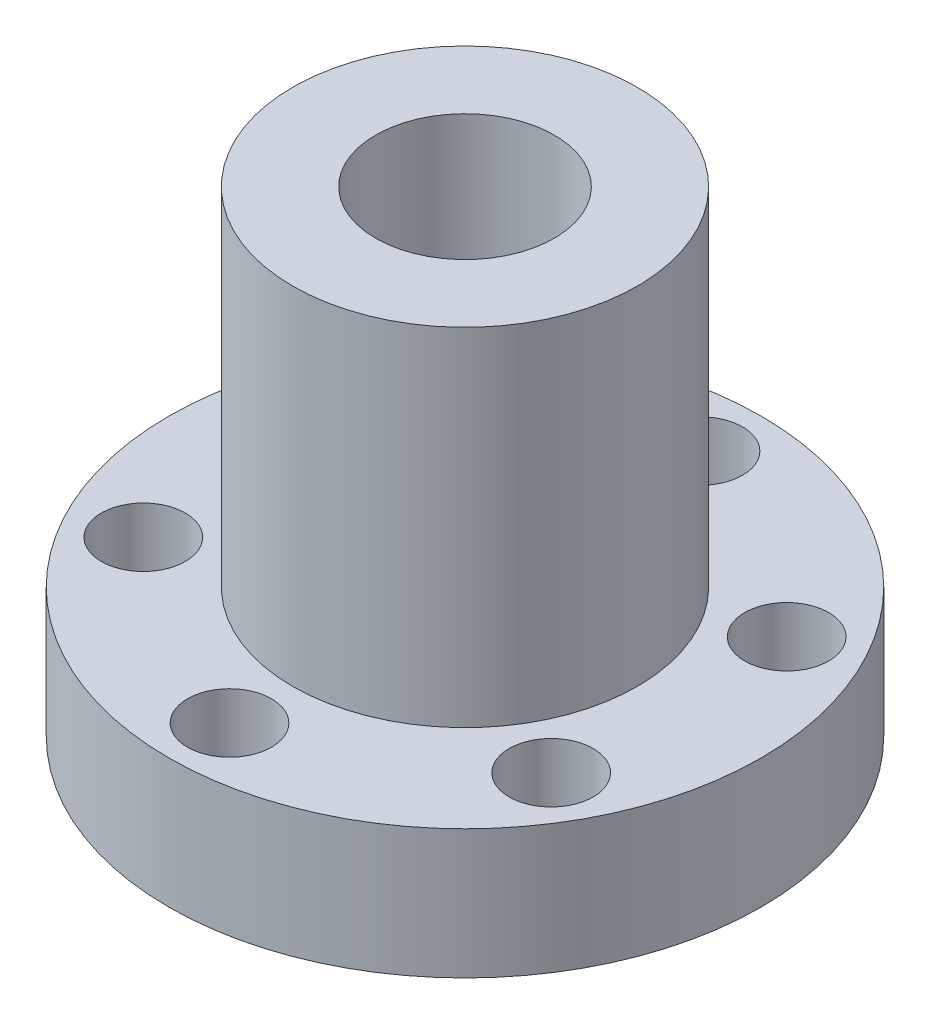
ISO-10303-21;
HEADER;
FILE_DESCRIPTION(('STEP AP214'),'2;1');
FILE_NAME('part.step','',(''),(''),'','','');
FILE_SCHEMA(('AUTOMOTIVE_DESIGN { 1 0 10303 214 1 1 1 1 }'));
ENDSEC;
DATA;
#1=APPLICATION_CONTEXT('core data for automotive mechanical design processes');
#2=APPLICATION_PROTOCOL_DEFINITION('international standard','automotive_design',2000,#1);
#3=PRODUCT_CONTEXT('',#1,'mechanical');
#4=PRODUCT('Part','Part','',(#3));
#5=PRODUCT_RELATED_PRODUCT_CATEGORY('part','',(#4));
#6=PRODUCT_DEFINITION_FORMATION('','',#4);
#7=PRODUCT_DEFINITION_CONTEXT('part definition',#1,'design');
#8=PRODUCT_DEFINITION('design','',#6,#7);
#9=PRODUCT_DEFINITION_SHAPE('','',#8);
#10=(LENGTH_UNIT() NAMED_UNIT(*) SI_UNIT(.MILLI.,.METRE.));
#11=(NAMED_UNIT(*) PLANE_ANGLE_UNIT() SI_UNIT($,.RADIAN.));
#12=(NAMED_UNIT(*) SI_UNIT($,.STERADIAN.) SOLID_ANGLE_UNIT());
#13=UNCERTAINTY_MEASURE_WITH_UNIT(LENGTH_MEASURE(1.E-05),#10,'distance_accuracy_value','');
#14=(GEOMETRIC_REPRESENTATION_CONTEXT(3) GLOBAL_UNCERTAINTY_ASSIGNED_CONTEXT((#13)) GLOBAL_UNIT_ASSIGNED_CONTEXT((#10,
#11,#12)) REPRESENTATION_CONTEXT('',''));
#15=CARTESIAN_POINT('',(0.,0.,0.));
#16=DIRECTION('',(0.,0.,1.));
#17=DIRECTION('',(1.,0.,0.));
#18=AXIS2_PLACEMENT_3D('',#15,#16,#17);
#19=CARTESIAN_POINT('',(0.,12.,0.));
#20=DIRECTION('',(0.,1.,0.));
#21=DIRECTION('',(0.,0.,1.));
#22=AXIS2_PLACEMENT_3D('',#19,#20,#21);
#23=PLANE('',#22);
#24=CARTESIAN_POINT('',(18.9399488772411,12.,10.9349845827129));
#25=DIRECTION('',(0.,1.,0.));
#26=DIRECTION('',(0.,0.,1.));
#27=AXIS2_PLACEMENT_3D('',#24,#25,#26);
#28=CIRCLE('',#27,3.9);
#29=CARTESIAN_POINT('',(18.9399488772411,12.,14.8349845827129));
#30=VERTEX_POINT('',#29);
#31=EDGE_CURVE('E57',#30,#30,#28,.F.);
#32=ORIENTED_EDGE('',*,*,#31,.T.);
#33=EDGE_LOOP('',(#32));
#34=FACE_BOUND('',#33,.T.);
#35=CARTESIAN_POINT('',(18.9399488772411,12.,-10.9349845827129));
#36=DIRECTION('',(0.,1.,0.));
#37=DIRECTION('',(0.,0.,1.));
#38=AXIS2_PLACEMENT_3D('',#35,#36,#37);
#39=CIRCLE('',#38,3.9);
#40=CARTESIAN_POINT('',(18.9399488772411,12.,-7.03498458271292));
#41=VERTEX_POINT('',#40);
#42=EDGE_CURVE('E60',#41,#41,#39,.F.);
#43=ORIENTED_EDGE('',*,*,#42,.T.);
#44=EDGE_LOOP('',(#43));
#45=FACE_BOUND('',#44,.T.);
#46=CARTESIAN_POINT('',(0.,12.,-21.8699691654258));
#47=DIRECTION('',(0.,1.,0.));
#48=DIRECTION('',(0.,0.,1.));
#49=AXIS2_PLACEMENT_3D('',#46,#47,#48);
#50=CIRCLE('',#49,3.9);
#51=CARTESIAN_POINT('',(0.,12.,-17.9699691654258));
#52=VERTEX_POINT('',#51);
#53=EDGE_CURVE('E63',#52,#52,#50,.F.);
#54=ORIENTED_EDGE('',*,*,#53,.T.);
#55=EDGE_LOOP('',(#54));
#56=FACE_BOUND('',#55,.T.);
#57=CARTESIAN_POINT('',(-18.9399488772411,12.,-10.9349845827129));
#58=DIRECTION('',(0.,1.,0.));
#59=DIRECTION('',(0.,0.,1.));
#60=AXIS2_PLACEMENT_3D('',#57,#58,#59);
#61=CIRCLE('',#60,3.9);
#62=CARTESIAN_POINT('',(-18.9399488772411,12.,-7.03498458271291));
#63=VERTEX_POINT('',#62);
#64=EDGE_CURVE('E66',#63,#63,#61,.F.);
#65=ORIENTED_EDGE('',*,*,#64,.T.);
#66=EDGE_LOOP('',(#65));
#67=FACE_BOUND('',#66,.T.);
#68=CARTESIAN_POINT('',(-18.9399488772411,12.,10.9349845827129));
#69=DIRECTION('',(0.,1.,0.));
#70=DIRECTION('',(0.,0.,1.));
#71=AXIS2_PLACEMENT_3D('',#68,#69,#70);
#72=CIRCLE('',#71,3.9);
#73=CARTESIAN_POINT('',(-18.9399488772411,12.,14.8349845827129));
#74=VERTEX_POINT('',#73);
#75=EDGE_CURVE('E69',#74,#74,#72,.F.);
#76=ORIENTED_EDGE('',*,*,#75,.T.);
#77=EDGE_LOOP('',(#76));
#78=FACE_BOUND('',#77,.T.);
#79=CARTESIAN_POINT('',(0.,12.,21.8699691654258));
#80=DIRECTION('',(0.,1.,0.));
#81=DIRECTION('',(0.,0.,1.));
#82=AXIS2_PLACEMENT_3D('',#79,#80,#81);
#83=CIRCLE('',#82,3.9);
#84=CARTESIAN_POINT('',(0.,12.,25.7699691654258));
#85=VERTEX_POINT('',#84);
#86=EDGE_CURVE('E72',#85,#85,#83,.F.);
#87=ORIENTED_EDGE('',*,*,#86,.T.);
#88=EDGE_LOOP('',(#87));
#89=FACE_BOUND('',#88,.T.);
#90=CARTESIAN_POINT('',(0.,12.,0.));
#91=DIRECTION('',(0.,1.,0.));
#92=DIRECTION('',(0.,0.,1.));
#93=AXIS2_PLACEMENT_3D('',#90,#91,#92);
#94=CIRCLE('',#93,27.5);
#95=CARTESIAN_POINT('',(0.,12.,27.5));
#96=VERTEX_POINT('',#95);
#97=EDGE_CURVE('E10',#96,#96,#94,.T.);
#98=ORIENTED_EDGE('',*,*,#97,.T.);
#99=EDGE_LOOP('',(#98));
#100=FACE_BOUND('',#99,.T.);
#101=CARTESIAN_POINT('',(0.,12.,0.));
#102=DIRECTION('',(0.,1.,0.));
#103=DIRECTION('',(0.,0.,1.));
#104=AXIS2_PLACEMENT_3D('',#101,#102,#103);
#105=CIRCLE('',#104,16.);
#106=CARTESIAN_POINT('',(0.,12.,16.));
#107=VERTEX_POINT('',#106);
#108=EDGE_CURVE('E50',#107,#107,#105,.T.);
#109=ORIENTED_EDGE('',*,*,#108,.F.);
#110=EDGE_LOOP('',(#109));
#111=FACE_BOUND('',#110,.T.);
#112=ADVANCED_FACE('F39',(#34,#45,#56,#67,#78,#89,#100,#111),#23,.T.);
#113=CARTESIAN_POINT('',(0.,0.,0.));
#114=DIRECTION('',(0.,1.,0.));
#115=DIRECTION('',(0.,0.,1.));
#116=AXIS2_PLACEMENT_3D('',#113,#114,#115);
#117=PLANE('',#116);
#118=CARTESIAN_POINT('',(18.9399488772411,0.,10.9349845827129));
#119=DIRECTION('',(0.,1.,0.));
#120=DIRECTION('',(0.,0.,1.));
#121=AXIS2_PLACEMENT_3D('',#118,#119,#120);
#122=CIRCLE('',#121,3.9);
#123=CARTESIAN_POINT('',(18.9399488772411,0.,14.8349845827129));
#124=VERTEX_POINT('',#123);
#125=EDGE_CURVE('E82',#124,#124,#122,.T.);
#126=ORIENTED_EDGE('',*,*,#125,.T.);
#127=EDGE_LOOP('',(#126));
#128=FACE_BOUND('',#127,.T.);
#129=CARTESIAN_POINT('',(18.9399488772411,0.,-10.9349845827129));
#130=DIRECTION('',(0.,1.,0.));
#131=DIRECTION('',(0.,0.,1.));
#132=AXIS2_PLACEMENT_3D('',#129,#130,#131);
#133=CIRCLE('',#132,3.9);
#134=CARTESIAN_POINT('',(18.9399488772411,0.,-7.03498458271292));
#135=VERTEX_POINT('',#134);
#136=EDGE_CURVE('E85',#135,#135,#133,.T.);
#137=ORIENTED_EDGE('',*,*,#136,.T.);
#138=EDGE_LOOP('',(#137));
#139=FACE_BOUND('',#138,.T.);
#140=CARTESIAN_POINT('',(0.,0.,-21.8699691654258));
#141=DIRECTION('',(0.,1.,0.));
#142=DIRECTION('',(0.,0.,1.));
#143=AXIS2_PLACEMENT_3D('',#140,#141,#142);
#144=CIRCLE('',#143,3.9);
#145=CARTESIAN_POINT('',(0.,0.,-17.9699691654258));
#146=VERTEX_POINT('',#145);
#147=EDGE_CURVE('E88',#146,#146,#144,.T.);
#148=ORIENTED_EDGE('',*,*,#147,.T.);
#149=EDGE_LOOP('',(#148));
#150=FACE_BOUND('',#149,.T.);
#151=CARTESIAN_POINT('',(-18.9399488772411,0.,-10.9349845827129));
#152=DIRECTION('',(0.,1.,0.));
#153=DIRECTION('',(0.,0.,1.));
#154=AXIS2_PLACEMENT_3D('',#151,#152,#153);
#155=CIRCLE('',#154,3.9);
#156=CARTESIAN_POINT('',(-18.9399488772411,0.,-7.03498458271291));
#157=VERTEX_POINT('',#156);
#158=EDGE_CURVE('E91',#157,#157,#155,.T.);
#159=ORIENTED_EDGE('',*,*,#158,.T.);
#160=EDGE_LOOP('',(#159));
#161=FACE_BOUND('',#160,.T.);
#162=CARTESIAN_POINT('',(-18.9399488772411,0.,10.9349845827129));
#163=DIRECTION('',(0.,1.,0.));
#164=DIRECTION('',(0.,0.,1.));
#165=AXIS2_PLACEMENT_3D('',#162,#163,#164);
#166=CIRCLE('',#165,3.9);
#167=CARTESIAN_POINT('',(-18.9399488772411,0.,14.8349845827129));
#168=VERTEX_POINT('',#167);
#169=EDGE_CURVE('E94',#168,#168,#166,.T.);
#170=ORIENTED_EDGE('',*,*,#169,.T.);
#171=EDGE_LOOP('',(#170));
#172=FACE_BOUND('',#171,.T.);
#173=CARTESIAN_POINT('',(0.,0.,21.8699691654258));
#174=DIRECTION('',(0.,1.,0.));
#175=DIRECTION('',(0.,0.,1.));
#176=AXIS2_PLACEMENT_3D('',#173,#174,#175);
#177=CIRCLE('',#176,3.9);
#178=CARTESIAN_POINT('',(0.,0.,25.7699691654258));
#179=VERTEX_POINT('',#178);
#180=EDGE_CURVE('E79',#179,#179,#177,.T.);
#181=ORIENTED_EDGE('',*,*,#180,.T.);
#182=EDGE_LOOP('',(#181));
#183=FACE_BOUND('',#182,.T.);
#184=CARTESIAN_POINT('',(0.,0.,0.));
#185=DIRECTION('',(0.,1.,0.));
#186=DIRECTION('',(0.,0.,1.));
#187=AXIS2_PLACEMENT_3D('',#184,#185,#186);
#188=CIRCLE('',#187,8.3);
#189=CARTESIAN_POINT('',(0.,0.,8.3));
#190=VERTEX_POINT('',#189);
#191=EDGE_CURVE('E76',#190,#190,#188,.T.);
#192=ORIENTED_EDGE('',*,*,#191,.T.);
#193=EDGE_LOOP('',(#192));
#194=FACE_BOUND('',#193,.T.);
#195=CARTESIAN_POINT('',(0.,0.,0.));
#196=DIRECTION('',(0.,1.,0.));
#197=DIRECTION('',(0.,0.,1.));
#198=AXIS2_PLACEMENT_3D('',#195,#196,#197);
#199=CIRCLE('',#198,27.5);
#200=CARTESIAN_POINT('',(0.,0.,27.5));
#201=VERTEX_POINT('',#200);
#202=EDGE_CURVE('E43',#201,#201,#199,.T.);
#203=ORIENTED_EDGE('',*,*,#202,.F.);
#204=EDGE_LOOP('',(#203));
#205=FACE_BOUND('',#204,.T.);
#206=ADVANCED_FACE('F100',(#128,#139,#150,#161,#172,#183,#194,#205),#117,.F.);
#207=CARTESIAN_POINT('',(0.,12.,0.));
#208=DIRECTION('',(0.,-1.,0.));
#209=DIRECTION('',(0.,0.,-1.));
#210=AXIS2_PLACEMENT_3D('',#207,#208,#209);
#211=CYLINDRICAL_SURFACE('',#210,27.5);
#212=ORIENTED_EDGE('',*,*,#97,.F.);
#213=EDGE_LOOP('',(#212));
#214=FACE_BOUND('',#213,.T.);
#215=ORIENTED_EDGE('',*,*,#202,.T.);
#216=EDGE_LOOP('',(#215));
#217=FACE_BOUND('',#216,.T.);
#218=ADVANCED_FACE('F41',(#214,#217),#211,.T.);
#219=CARTESIAN_POINT('',(0.,44.2,0.));
#220=DIRECTION('',(0.,-1.,0.));
#221=DIRECTION('',(0.,0.,-1.));
#222=AXIS2_PLACEMENT_3D('',#219,#220,#221);
#223=CYLINDRICAL_SURFACE('',#222,16.);
#224=ORIENTED_EDGE('',*,*,#108,.T.);
#225=EDGE_LOOP('',(#224));
#226=FACE_BOUND('',#225,.T.);
#227=CARTESIAN_POINT('',(0.,44.2,0.));
#228=DIRECTION('',(0.,1.,0.));
#229=DIRECTION('',(0.,0.,1.));
#230=AXIS2_PLACEMENT_3D('',#227,#228,#229);
#231=CIRCLE('',#230,16.);
#232=CARTESIAN_POINT('',(0.,44.2,16.));
#233=VERTEX_POINT('',#232);
#234=EDGE_CURVE('E54',#233,#233,#231,.T.);
#235=ORIENTED_EDGE('',*,*,#234,.F.);
#236=EDGE_LOOP('',(#235));
#237=FACE_BOUND('',#236,.T.);
#238=ADVANCED_FACE('F130',(#226,#237),#223,.T.);
#239=CARTESIAN_POINT('',(0.,44.2,0.));
#240=DIRECTION('',(0.,1.,0.));
#241=DIRECTION('',(0.,0.,1.));
#242=AXIS2_PLACEMENT_3D('',#239,#240,#241);
#243=PLANE('',#242);
#244=CARTESIAN_POINT('',(0.,44.2,0.));
#245=DIRECTION('',(0.,1.,0.));
#246=DIRECTION('',(0.,0.,1.));
#247=AXIS2_PLACEMENT_3D('',#244,#245,#246);
#248=CIRCLE('',#247,8.3);
#249=CARTESIAN_POINT('',(0.,44.2,8.3));
#250=VERTEX_POINT('',#249);
#251=EDGE_CURVE('E75',#250,#250,#248,.T.);
#252=ORIENTED_EDGE('',*,*,#251,.F.);
#253=EDGE_LOOP('',(#252));
#254=FACE_BOUND('',#253,.T.);
#255=ORIENTED_EDGE('',*,*,#234,.T.);
#256=EDGE_LOOP('',(#255));
#257=FACE_BOUND('',#256,.T.);
#258=ADVANCED_FACE('F116',(#254,#257),#243,.T.);
#259=CARTESIAN_POINT('',(0.,44.2,0.));
#260=DIRECTION('',(0.,-1.,0.));
#261=DIRECTION('',(0.,0.,-1.));
#262=AXIS2_PLACEMENT_3D('',#259,#260,#261);
#263=CYLINDRICAL_SURFACE('',#262,8.3);
#264=ORIENTED_EDGE('',*,*,#251,.T.);
#265=EDGE_LOOP('',(#264));
#266=FACE_BOUND('',#265,.T.);
#267=ORIENTED_EDGE('',*,*,#191,.F.);
#268=EDGE_LOOP('',(#267));
#269=FACE_BOUND('',#268,.T.);
#270=ADVANCED_FACE('F106',(#266,#269),#263,.F.);
#271=CARTESIAN_POINT('',(0.,44.2,21.8699691654258));
#272=DIRECTION('',(0.,-1.,0.));
#273=DIRECTION('',(0.,0.,-1.));
#274=AXIS2_PLACEMENT_3D('',#271,#272,#273);
#275=CYLINDRICAL_SURFACE('',#274,3.9);
#276=ORIENTED_EDGE('',*,*,#86,.F.);
#277=EDGE_LOOP('',(#276));
#278=FACE_BOUND('',#277,.T.);
#279=ORIENTED_EDGE('',*,*,#180,.F.);
#280=EDGE_LOOP('',(#279));
#281=FACE_BOUND('',#280,.T.);
#282=ADVANCED_FACE('F103',(#278,#281),#275,.F.);
#283=CARTESIAN_POINT('',(-18.9399488772411,44.2,10.9349845827129));
#284=DIRECTION('',(0.,-1.,0.));
#285=DIRECTION('',(0.,0.,-1.));
#286=AXIS2_PLACEMENT_3D('',#283,#284,#285);
#287=CYLINDRICAL_SURFACE('',#286,3.9);
#288=ORIENTED_EDGE('',*,*,#75,.F.);
#289=EDGE_LOOP('',(#288));
#290=FACE_BOUND('',#289,.T.);
#291=ORIENTED_EDGE('',*,*,#169,.F.);
#292=EDGE_LOOP('',(#291));
#293=FACE_BOUND('',#292,.T.);
#294=ADVANCED_FACE('F105',(#290,#293),#287,.F.);
#295=CARTESIAN_POINT('',(-18.9399488772411,44.2,-10.9349845827129));
#296=DIRECTION('',(0.,-1.,0.));
#297=DIRECTION('',(0.,0.,-1.));
#298=AXIS2_PLACEMENT_3D('',#295,#296,#297);
#299=CYLINDRICAL_SURFACE('',#298,3.9);
#300=ORIENTED_EDGE('',*,*,#64,.F.);
#301=EDGE_LOOP('',(#300));
#302=FACE_BOUND('',#301,.T.);
#303=ORIENTED_EDGE('',*,*,#158,.F.);
#304=EDGE_LOOP('',(#303));
#305=FACE_BOUND('',#304,.T.);
#306=ADVANCED_FACE('F113',(#302,#305),#299,.F.);
#307=CARTESIAN_POINT('',(0.,44.2,-21.8699691654258));
#308=DIRECTION('',(0.,-1.,0.));
#309=DIRECTION('',(0.,0.,-1.));
#310=AXIS2_PLACEMENT_3D('',#307,#308,#309);
#311=CYLINDRICAL_SURFACE('',#310,3.9);
#312=ORIENTED_EDGE('',*,*,#53,.F.);
#313=EDGE_LOOP('',(#312));
#314=FACE_BOUND('',#313,.T.);
#315=ORIENTED_EDGE('',*,*,#147,.F.);
#316=EDGE_LOOP('',(#315));
#317=FACE_BOUND('',#316,.T.);
#318=ADVANCED_FACE('F143',(#314,#317),#311,.F.);
#319=CARTESIAN_POINT('',(18.9399488772411,44.2,-10.9349845827129));
#320=DIRECTION('',(0.,-1.,0.));
#321=DIRECTION('',(0.,0.,-1.));
#322=AXIS2_PLACEMENT_3D('',#319,#320,#321);
#323=CYLINDRICAL_SURFACE('',#322,3.9);
#324=ORIENTED_EDGE('',*,*,#42,.F.);
#325=EDGE_LOOP('',(#324));
#326=FACE_BOUND('',#325,.T.);
#327=ORIENTED_EDGE('',*,*,#136,.F.);
#328=EDGE_LOOP('',(#327));
#329=FACE_BOUND('',#328,.T.);
#330=ADVANCED_FACE('F139',(#326,#329),#323,.F.);
#331=CARTESIAN_POINT('',(18.9399488772411,44.2,10.9349845827129));
#332=DIRECTION('',(0.,-1.,0.));
#333=DIRECTION('',(0.,0.,-1.));
#334=AXIS2_PLACEMENT_3D('',#331,#332,#333);
#335=CYLINDRICAL_SURFACE('',#334,3.9);
#336=ORIENTED_EDGE('',*,*,#31,.F.);
#337=EDGE_LOOP('',(#336));
#338=FACE_BOUND('',#337,.T.);
#339=ORIENTED_EDGE('',*,*,#125,.F.);
#340=EDGE_LOOP('',(#339));
#341=FACE_BOUND('',#340,.T.);
#342=ADVANCED_FACE('F136',(#338,#341),#335,.F.);
#343=CLOSED_SHELL('',(#112,#206,#218,#238,#258,#270,#282,#294,#306,#318,#330,#342));
#344=MANIFOLD_SOLID_BREP('B2',#343);
#345=ADVANCED_BREP_SHAPE_REPRESENTATION('',(#18,#344),#14);
#346=SHAPE_DEFINITION_REPRESENTATION(#9,#345);
ENDSEC;
END-ISO-10303-21;
